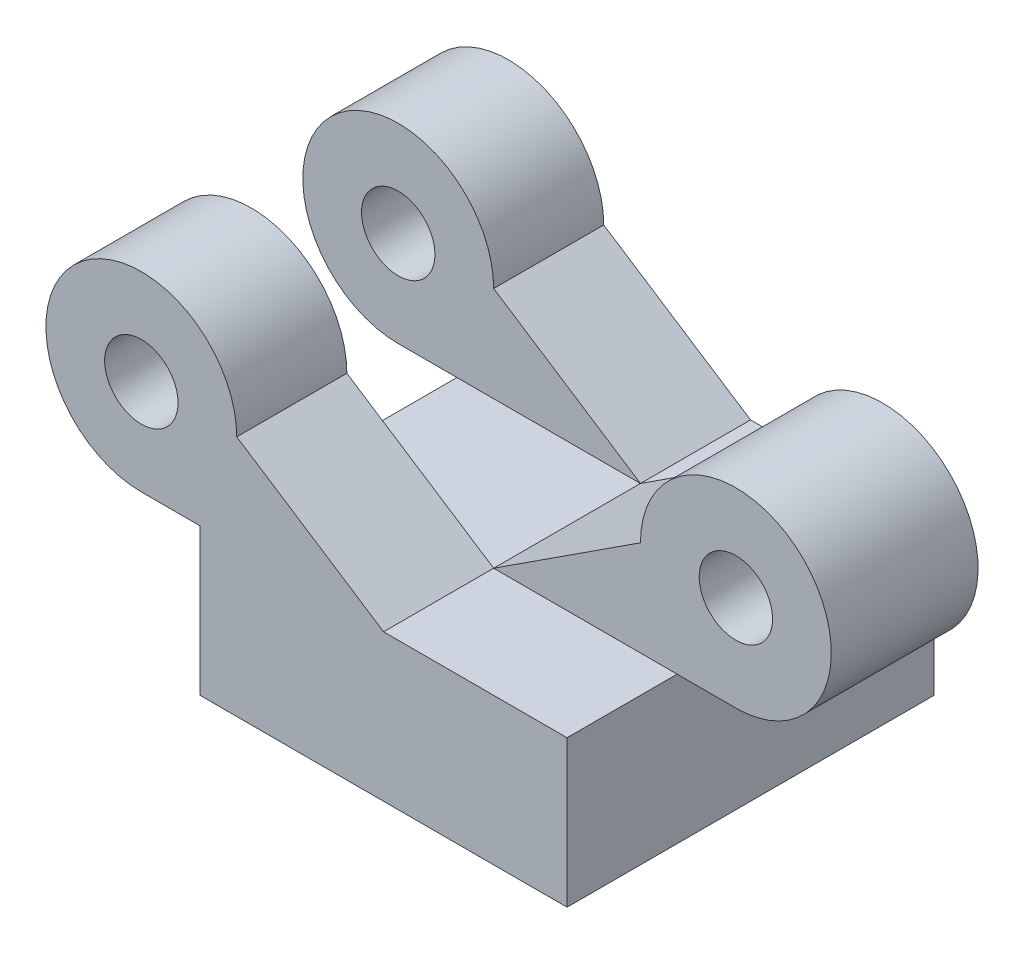
ISO-10303-21;
HEADER;
FILE_DESCRIPTION(('STEP AP214'),'2;1');
FILE_NAME('part.step','',(''),(''),'','','');
FILE_SCHEMA(('AUTOMOTIVE_DESIGN { 1 0 10303 214 1 1 1 1 }'));
ENDSEC;
DATA;
#1=APPLICATION_CONTEXT('core data for automotive mechanical design processes');
#2=APPLICATION_PROTOCOL_DEFINITION('international standard','automotive_design',2000,#1);
#3=PRODUCT_CONTEXT('',#1,'mechanical');
#4=PRODUCT('Part','Part','',(#3));
#5=PRODUCT_RELATED_PRODUCT_CATEGORY('part','',(#4));
#6=PRODUCT_DEFINITION_FORMATION('','',#4);
#7=PRODUCT_DEFINITION_CONTEXT('part definition',#1,'design');
#8=PRODUCT_DEFINITION('design','',#6,#7);
#9=PRODUCT_DEFINITION_SHAPE('','',#8);
#10=(LENGTH_UNIT() NAMED_UNIT(*) SI_UNIT(.MILLI.,.METRE.));
#11=(NAMED_UNIT(*) PLANE_ANGLE_UNIT() SI_UNIT($,.RADIAN.));
#12=(NAMED_UNIT(*) SI_UNIT($,.STERADIAN.) SOLID_ANGLE_UNIT());
#13=UNCERTAINTY_MEASURE_WITH_UNIT(LENGTH_MEASURE(1.E-05),#10,'distance_accuracy_value','');
#14=(GEOMETRIC_REPRESENTATION_CONTEXT(3) GLOBAL_UNCERTAINTY_ASSIGNED_CONTEXT((#13)) GLOBAL_UNIT_ASSIGNED_CONTEXT((#10,
#11,#12)) REPRESENTATION_CONTEXT('',''));
#15=CARTESIAN_POINT('',(0.,0.,0.));
#16=DIRECTION('',(0.,0.,1.));
#17=DIRECTION('',(1.,0.,0.));
#18=AXIS2_PLACEMENT_3D('',#15,#16,#17);
#19=CARTESIAN_POINT('',(-12.5,-10.,12.5));
#20=DIRECTION('',(0.,0.,1.));
#21=DIRECTION('',(1.,0.,0.));
#22=AXIS2_PLACEMENT_3D('',#19,#20,#21);
#23=PLANE('',#22);
#24=CARTESIAN_POINT('',(-16.5,6.5,12.5));
#25=DIRECTION('',(0.,0.,1.));
#26=DIRECTION('',(1.,0.,0.));
#27=AXIS2_PLACEMENT_3D('',#24,#25,#26);
#28=CIRCLE('',#27,2.5);
#29=CARTESIAN_POINT('',(-14.,6.5,12.5));
#30=VERTEX_POINT('',#29);
#31=EDGE_CURVE('E241',#30,#30,#28,.T.);
#32=ORIENTED_EDGE('',*,*,#31,.F.);
#33=EDGE_LOOP('',(#32));
#34=FACE_BOUND('',#33,.T.);
#35=DIRECTION('',(0.,1.,0.));
#36=VECTOR('',#35,1.);
#37=CARTESIAN_POINT('',(12.5,-10.,12.5));
#38=LINE('',#37,#36);
#39=CARTESIAN_POINT('',(12.5,-10.,12.5));
#40=VERTEX_POINT('',#39);
#41=CARTESIAN_POINT('',(12.5,0.,12.5));
#42=VERTEX_POINT('',#41);
#43=EDGE_CURVE('E12',#40,#42,#38,.T.);
#44=ORIENTED_EDGE('',*,*,#43,.T.);
#45=DIRECTION('',(-1.,0.,0.));
#46=VECTOR('',#45,1.);
#47=CARTESIAN_POINT('',(-12.5,0.,12.5));
#48=LINE('',#47,#46);
#49=CARTESIAN_POINT('',(0.,0.,12.5));
#50=VERTEX_POINT('',#49);
#51=EDGE_CURVE('E307',#42,#50,#48,.T.);
#52=ORIENTED_EDGE('',*,*,#51,.T.);
#53=DIRECTION('',(0.838443616300637,-0.544988350595414,0.));
#54=VECTOR('',#53,1.);
#55=CARTESIAN_POINT('',(0.,0.,12.5));
#56=LINE('',#55,#54);
#57=CARTESIAN_POINT('',(-10.,6.5,12.5));
#58=VERTEX_POINT('',#57);
#59=EDGE_CURVE('E252',#58,#50,#56,.T.);
#60=ORIENTED_EDGE('',*,*,#59,.F.);
#61=CARTESIAN_POINT('',(-16.5,6.5,12.5));
#62=DIRECTION('',(0.,0.,1.));
#63=DIRECTION('',(1.,0.,0.));
#64=AXIS2_PLACEMENT_3D('',#61,#62,#63);
#65=CIRCLE('',#64,6.5);
#66=CARTESIAN_POINT('',(-16.5,0.,12.5));
#67=VERTEX_POINT('',#66);
#68=EDGE_CURVE('E246',#58,#67,#65,.T.);
#69=ORIENTED_EDGE('',*,*,#68,.T.);
#70=DIRECTION('',(1.,0.,0.));
#71=VECTOR('',#70,1.);
#72=CARTESIAN_POINT('',(0.,0.,12.5));
#73=LINE('',#72,#71);
#74=CARTESIAN_POINT('',(-12.5,0.,12.5));
#75=VERTEX_POINT('',#74);
#76=EDGE_CURVE('E249',#67,#75,#73,.T.);
#77=ORIENTED_EDGE('',*,*,#76,.T.);
#78=DIRECTION('',(0.,1.,0.));
#79=VECTOR('',#78,1.);
#80=CARTESIAN_POINT('',(-12.5,-10.,12.5));
#81=LINE('',#80,#79);
#82=CARTESIAN_POINT('',(-12.5,-10.,12.5));
#83=VERTEX_POINT('',#82);
#84=EDGE_CURVE('E80',#83,#75,#81,.T.);
#85=ORIENTED_EDGE('',*,*,#84,.F.);
#86=DIRECTION('',(1.,0.,0.));
#87=VECTOR('',#86,1.);
#88=CARTESIAN_POINT('',(-12.5,-10.,12.5));
#89=LINE('',#88,#87);
#90=EDGE_CURVE('E283',#83,#40,#89,.T.);
#91=ORIENTED_EDGE('',*,*,#90,.T.);
#92=EDGE_LOOP('',(#44,#52,#60,#69,#77,#85,#91));
#93=FACE_BOUND('',#92,.T.);
#94=ADVANCED_FACE('F71',(#34,#93),#23,.T.);
#95=CARTESIAN_POINT('',(-12.5,-10.,-12.5));
#96=DIRECTION('',(0.,0.,-1.));
#97=DIRECTION('',(-1.,0.,0.));
#98=AXIS2_PLACEMENT_3D('',#95,#96,#97);
#99=PLANE('',#98);
#100=CARTESIAN_POINT('',(-16.5,6.5,-12.5));
#101=DIRECTION('',(0.,0.,1.));
#102=DIRECTION('',(1.,0.,0.));
#103=AXIS2_PLACEMENT_3D('',#100,#101,#102);
#104=CIRCLE('',#103,2.5);
#105=CARTESIAN_POINT('',(-14.,6.5,-12.5));
#106=VERTEX_POINT('',#105);
#107=EDGE_CURVE('E255',#106,#106,#104,.T.);
#108=ORIENTED_EDGE('',*,*,#107,.T.);
#109=EDGE_LOOP('',(#108));
#110=FACE_BOUND('',#109,.T.);
#111=DIRECTION('',(0.838443616300637,-0.544988350595414,0.));
#112=VECTOR('',#111,1.);
#113=CARTESIAN_POINT('',(0.,0.,-12.5));
#114=LINE('',#113,#112);
#115=CARTESIAN_POINT('',(-10.,6.5,-12.5));
#116=VERTEX_POINT('',#115);
#117=CARTESIAN_POINT('',(0.,0.,-12.5));
#118=VERTEX_POINT('',#117);
#119=EDGE_CURVE('E264',#116,#118,#114,.T.);
#120=ORIENTED_EDGE('',*,*,#119,.T.);
#121=DIRECTION('',(1.,0.,0.));
#122=VECTOR('',#121,1.);
#123=CARTESIAN_POINT('',(-12.5,0.,-12.5));
#124=LINE('',#123,#122);
#125=CARTESIAN_POINT('',(12.5,0.,-12.5));
#126=VERTEX_POINT('',#125);
#127=EDGE_CURVE('E96',#118,#126,#124,.T.);
#128=ORIENTED_EDGE('',*,*,#127,.T.);
#129=DIRECTION('',(0.,1.,0.));
#130=VECTOR('',#129,1.);
#131=CARTESIAN_POINT('',(12.5,-10.,-12.5));
#132=LINE('',#131,#130);
#133=CARTESIAN_POINT('',(12.5,-10.,-12.5));
#134=VERTEX_POINT('',#133);
#135=EDGE_CURVE('E286',#134,#126,#132,.T.);
#136=ORIENTED_EDGE('',*,*,#135,.F.);
#137=DIRECTION('',(-1.,0.,0.));
#138=VECTOR('',#137,1.);
#139=CARTESIAN_POINT('',(-12.5,-10.,-12.5));
#140=LINE('',#139,#138);
#141=CARTESIAN_POINT('',(-12.5,-10.,-12.5));
#142=VERTEX_POINT('',#141);
#143=EDGE_CURVE('E276',#134,#142,#140,.T.);
#144=ORIENTED_EDGE('',*,*,#143,.T.);
#145=DIRECTION('',(0.,1.,0.));
#146=VECTOR('',#145,1.);
#147=CARTESIAN_POINT('',(-12.5,-10.,-12.5));
#148=LINE('',#147,#146);
#149=CARTESIAN_POINT('',(-12.5,0.,-12.5));
#150=VERTEX_POINT('',#149);
#151=EDGE_CURVE('E294',#142,#150,#148,.T.);
#152=ORIENTED_EDGE('',*,*,#151,.T.);
#153=DIRECTION('',(1.,0.,0.));
#154=VECTOR('',#153,1.);
#155=CARTESIAN_POINT('',(0.,0.,-12.5));
#156=LINE('',#155,#154);
#157=CARTESIAN_POINT('',(-16.5,0.,-12.5));
#158=VERTEX_POINT('',#157);
#159=EDGE_CURVE('E261',#158,#150,#156,.T.);
#160=ORIENTED_EDGE('',*,*,#159,.F.);
#161=CARTESIAN_POINT('',(-16.5,6.5,-12.5));
#162=DIRECTION('',(0.,0.,1.));
#163=DIRECTION('',(1.,0.,0.));
#164=AXIS2_PLACEMENT_3D('',#161,#162,#163);
#165=CIRCLE('',#164,6.5);
#166=EDGE_CURVE('E258',#116,#158,#165,.T.);
#167=ORIENTED_EDGE('',*,*,#166,.F.);
#168=EDGE_LOOP('',(#120,#128,#136,#144,#152,#160,#167));
#169=FACE_BOUND('',#168,.T.);
#170=ADVANCED_FACE('F350',(#110,#169),#99,.T.);
#171=CARTESIAN_POINT('',(0.,0.,12.5));
#172=DIRECTION('',(0.,-1.,0.));
#173=DIRECTION('',(1.,0.,0.));
#174=AXIS2_PLACEMENT_3D('',#171,#172,#173);
#175=PLANE('',#174);
#176=DIRECTION('',(0.,0.,-1.));
#177=VECTOR('',#176,1.);
#178=CARTESIAN_POINT('',(12.5,0.,-12.5));
#179=LINE('',#178,#177);
#180=CARTESIAN_POINT('',(12.5,0.,5.));
#181=VERTEX_POINT('',#180);
#182=CARTESIAN_POINT('',(12.5,0.,-5.));
#183=VERTEX_POINT('',#182);
#184=EDGE_CURVE('E268',#181,#183,#179,.T.);
#185=ORIENTED_EDGE('',*,*,#184,.T.);
#186=DIRECTION('',(1.,0.,0.));
#187=VECTOR('',#186,1.);
#188=CARTESIAN_POINT('',(0.,0.,-5.));
#189=LINE('',#188,#187);
#190=CARTESIAN_POINT('',(16.5,0.,-5.));
#191=VERTEX_POINT('',#190);
#192=EDGE_CURVE('E181',#183,#191,#189,.T.);
#193=ORIENTED_EDGE('',*,*,#192,.T.);
#194=DIRECTION('',(0.,0.,-1.));
#195=VECTOR('',#194,1.);
#196=CARTESIAN_POINT('',(16.5,0.,12.5));
#197=LINE('',#196,#195);
#198=CARTESIAN_POINT('',(16.5,0.,5.));
#199=VERTEX_POINT('',#198);
#200=EDGE_CURVE('E239',#199,#191,#197,.T.);
#201=ORIENTED_EDGE('',*,*,#200,.F.);
#202=DIRECTION('',(1.,0.,0.));
#203=VECTOR('',#202,1.);
#204=CARTESIAN_POINT('',(0.,0.,5.));
#205=LINE('',#204,#203);
#206=EDGE_CURVE('E343',#181,#199,#205,.T.);
#207=ORIENTED_EDGE('',*,*,#206,.F.);
#208=EDGE_LOOP('',(#185,#193,#201,#207));
#209=FACE_BOUND('',#208,.T.);
#210=ADVANCED_FACE('F348',(#209),#175,.T.);
#211=CARTESIAN_POINT('',(16.5,6.50000000000001,12.5));
#212=DIRECTION('',(0.,0.,-1.));
#213=DIRECTION('',(-1.,0.,0.));
#214=AXIS2_PLACEMENT_3D('',#211,#212,#213);
#215=CYLINDRICAL_SURFACE('',#214,6.5);
#216=ORIENTED_EDGE('',*,*,#200,.T.);
#217=CARTESIAN_POINT('',(16.5,6.50000000000001,-5.));
#218=DIRECTION('',(0.,0.,-1.));
#219=DIRECTION('',(-1.,0.,0.));
#220=AXIS2_PLACEMENT_3D('',#217,#218,#219);
#221=CIRCLE('',#220,6.5);
#222=CARTESIAN_POINT('',(10.,6.50000000000001,-5.));
#223=VERTEX_POINT('',#222);
#224=EDGE_CURVE('E203',#191,#223,#221,.F.);
#225=ORIENTED_EDGE('',*,*,#224,.T.);
#226=DIRECTION('',(0.,0.,-1.));
#227=VECTOR('',#226,1.);
#228=CARTESIAN_POINT('',(10.,6.50000000000001,12.5));
#229=LINE('',#228,#227);
#230=CARTESIAN_POINT('',(10.,6.50000000000001,5.));
#231=VERTEX_POINT('',#230);
#232=EDGE_CURVE('E202',#231,#223,#229,.T.);
#233=ORIENTED_EDGE('',*,*,#232,.F.);
#234=CARTESIAN_POINT('',(16.5,6.50000000000001,5.));
#235=DIRECTION('',(0.,0.,-1.));
#236=DIRECTION('',(-1.,0.,0.));
#237=AXIS2_PLACEMENT_3D('',#234,#235,#236);
#238=CIRCLE('',#237,6.5);
#239=EDGE_CURVE('E301',#199,#231,#238,.F.);
#240=ORIENTED_EDGE('',*,*,#239,.F.);
#241=EDGE_LOOP('',(#216,#225,#233,#240));
#242=FACE_BOUND('',#241,.T.);
#243=ADVANCED_FACE('F419',(#242),#215,.T.);
#244=CARTESIAN_POINT('',(0.,0.,12.5));
#245=DIRECTION('',(0.544988350595415,-0.838443616300637,0.));
#246=DIRECTION('',(0.838443616300637,0.544988350595415,0.));
#247=AXIS2_PLACEMENT_3D('',#244,#245,#246);
#248=PLANE('',#247);
#249=DIRECTION('',(0.838443616300637,0.544988350595415,0.));
#250=VECTOR('',#249,1.);
#251=CARTESIAN_POINT('',(0.,0.,-5.));
#252=LINE('',#251,#250);
#253=CARTESIAN_POINT('',(0.,0.,-5.));
#254=VERTEX_POINT('',#253);
#255=EDGE_CURVE('E178',#254,#223,#252,.T.);
#256=ORIENTED_EDGE('',*,*,#255,.F.);
#257=DIRECTION('',(0.,0.,1.));
#258=VECTOR('',#257,1.);
#259=CARTESIAN_POINT('',(0.,0.,0.));
#260=LINE('',#259,#258);
#261=CARTESIAN_POINT('',(0.,0.,5.));
#262=VERTEX_POINT('',#261);
#263=EDGE_CURVE('E199',#254,#262,#260,.T.);
#264=ORIENTED_EDGE('',*,*,#263,.T.);
#265=DIRECTION('',(0.838443616300637,0.544988350595415,0.));
#266=VECTOR('',#265,1.);
#267=CARTESIAN_POINT('',(0.,0.,5.));
#268=LINE('',#267,#266);
#269=EDGE_CURVE('E298',#262,#231,#268,.T.);
#270=ORIENTED_EDGE('',*,*,#269,.T.);
#271=ORIENTED_EDGE('',*,*,#232,.T.);
#272=EDGE_LOOP('',(#256,#264,#270,#271));
#273=FACE_BOUND('',#272,.T.);
#274=ADVANCED_FACE('F196',(#273),#248,.F.);
#275=CARTESIAN_POINT('',(-16.5,6.5,-12.5));
#276=DIRECTION('',(0.,0.,1.));
#277=DIRECTION('',(1.,0.,0.));
#278=AXIS2_PLACEMENT_3D('',#275,#276,#277);
#279=CYLINDRICAL_SURFACE('',#278,6.5);
#280=DIRECTION('',(0.,0.,1.));
#281=VECTOR('',#280,1.);
#282=CARTESIAN_POINT('',(-16.5,0.,-12.5));
#283=LINE('',#282,#281);
#284=CARTESIAN_POINT('',(-16.5,0.,-5.));
#285=VERTEX_POINT('',#284);
#286=EDGE_CURVE('E270',#158,#285,#283,.T.);
#287=ORIENTED_EDGE('',*,*,#286,.T.);
#288=CARTESIAN_POINT('',(-16.5,6.5,-5.));
#289=DIRECTION('',(0.,0.,1.));
#290=DIRECTION('',(1.,0.,0.));
#291=AXIS2_PLACEMENT_3D('',#288,#289,#290);
#292=CIRCLE('',#291,6.5);
#293=CARTESIAN_POINT('',(-10.,6.5,-5.));
#294=VERTEX_POINT('',#293);
#295=EDGE_CURVE('E228',#285,#294,#292,.F.);
#296=ORIENTED_EDGE('',*,*,#295,.T.);
#297=DIRECTION('',(0.,0.,1.));
#298=VECTOR('',#297,1.);
#299=CARTESIAN_POINT('',(-10.,6.5,-12.5));
#300=LINE('',#299,#298);
#301=EDGE_CURVE('E227',#116,#294,#300,.T.);
#302=ORIENTED_EDGE('',*,*,#301,.F.);
#303=ORIENTED_EDGE('',*,*,#166,.T.);
#304=EDGE_LOOP('',(#287,#296,#302,#303));
#305=FACE_BOUND('',#304,.T.);
#306=ADVANCED_FACE('F355',(#305),#279,.T.);
#307=CARTESIAN_POINT('',(0.,0.,-12.5));
#308=DIRECTION('',(-0.544988350595414,-0.838443616300637,0.));
#309=DIRECTION('',(0.838443616300637,-0.544988350595414,0.));
#310=AXIS2_PLACEMENT_3D('',#307,#308,#309);
#311=PLANE('',#310);
#312=DIRECTION('',(-0.838443616300637,0.544988350595414,0.));
#313=VECTOR('',#312,1.);
#314=CARTESIAN_POINT('',(0.,0.,-5.));
#315=LINE('',#314,#313);
#316=EDGE_CURVE('E210',#254,#294,#315,.T.);
#317=ORIENTED_EDGE('',*,*,#316,.F.);
#318=DIRECTION('',(0.,0.,-1.));
#319=VECTOR('',#318,1.);
#320=CARTESIAN_POINT('',(0.,0.,0.));
#321=LINE('',#320,#319);
#322=EDGE_CURVE('E183',#254,#118,#321,.T.);
#323=ORIENTED_EDGE('',*,*,#322,.T.);
#324=ORIENTED_EDGE('',*,*,#119,.F.);
#325=ORIENTED_EDGE('',*,*,#301,.T.);
#326=EDGE_LOOP('',(#317,#323,#324,#325));
#327=FACE_BOUND('',#326,.T.);
#328=ADVANCED_FACE('F226',(#327),#311,.F.);
#329=CARTESIAN_POINT('',(-16.5,6.5,-12.5));
#330=DIRECTION('',(0.,0.,1.));
#331=DIRECTION('',(1.,0.,0.));
#332=AXIS2_PLACEMENT_3D('',#329,#330,#331);
#333=CYLINDRICAL_SURFACE('',#332,2.5);
#334=ORIENTED_EDGE('',*,*,#107,.F.);
#335=EDGE_LOOP('',(#334));
#336=FACE_BOUND('',#335,.T.);
#337=CARTESIAN_POINT('',(-16.5,6.5,-5.));
#338=DIRECTION('',(0.,0.,1.));
#339=DIRECTION('',(1.,0.,0.));
#340=AXIS2_PLACEMENT_3D('',#337,#338,#339);
#341=CIRCLE('',#340,2.5);
#342=CARTESIAN_POINT('',(-14.,6.5,-5.));
#343=VERTEX_POINT('',#342);
#344=EDGE_CURVE('E229',#343,#343,#341,.F.);
#345=ORIENTED_EDGE('',*,*,#344,.F.);
#346=EDGE_LOOP('',(#345));
#347=FACE_BOUND('',#346,.T.);
#348=ADVANCED_FACE('F390',(#336,#347),#333,.F.);
#349=CARTESIAN_POINT('',(0.,0.,-12.5));
#350=DIRECTION('',(0.,-1.,0.));
#351=DIRECTION('',(0.,0.,-1.));
#352=AXIS2_PLACEMENT_3D('',#349,#350,#351);
#353=PLANE('',#352);
#354=DIRECTION('',(0.,0.,1.));
#355=VECTOR('',#354,1.);
#356=CARTESIAN_POINT('',(-12.5,0.,-12.5));
#357=LINE('',#356,#355);
#358=CARTESIAN_POINT('',(-12.5,0.,-5.));
#359=VERTEX_POINT('',#358);
#360=EDGE_CURVE('E277',#150,#359,#357,.T.);
#361=ORIENTED_EDGE('',*,*,#360,.T.);
#362=DIRECTION('',(-1.,0.,0.));
#363=VECTOR('',#362,1.);
#364=CARTESIAN_POINT('',(0.,0.,-5.));
#365=LINE('',#364,#363);
#366=EDGE_CURVE('E213',#359,#285,#365,.T.);
#367=ORIENTED_EDGE('',*,*,#366,.T.);
#368=ORIENTED_EDGE('',*,*,#286,.F.);
#369=ORIENTED_EDGE('',*,*,#159,.T.);
#370=EDGE_LOOP('',(#361,#367,#368,#369));
#371=FACE_BOUND('',#370,.T.);
#372=ADVANCED_FACE('F357',(#371),#353,.T.);
#373=CARTESIAN_POINT('',(12.5,-10.,-12.5));
#374=DIRECTION('',(1.,0.,0.));
#375=DIRECTION('',(0.,0.,-1.));
#376=AXIS2_PLACEMENT_3D('',#373,#374,#375);
#377=PLANE('',#376);
#378=EDGE_CURVE('E287',#42,#181,#179,.T.);
#379=ORIENTED_EDGE('',*,*,#378,.F.);
#380=ORIENTED_EDGE('',*,*,#43,.F.);
#381=DIRECTION('',(0.,0.,-1.));
#382=VECTOR('',#381,1.);
#383=CARTESIAN_POINT('',(12.5,-10.,-12.5));
#384=LINE('',#383,#382);
#385=EDGE_CURVE('E273',#40,#134,#384,.T.);
#386=ORIENTED_EDGE('',*,*,#385,.T.);
#387=ORIENTED_EDGE('',*,*,#135,.T.);
#388=DIRECTION('',(0.,0.,1.));
#389=VECTOR('',#388,1.);
#390=CARTESIAN_POINT('',(12.5,0.,-12.5));
#391=LINE('',#390,#389);
#392=EDGE_CURVE('E311',#126,#183,#391,.T.);
#393=ORIENTED_EDGE('',*,*,#392,.T.);
#394=ORIENTED_EDGE('',*,*,#184,.F.);
#395=EDGE_LOOP('',(#379,#380,#386,#387,#393,#394));
#396=FACE_BOUND('',#395,.T.);
#397=ADVANCED_FACE('F73',(#396),#377,.T.);
#398=CARTESIAN_POINT('',(-12.5,-10.,-12.5));
#399=DIRECTION('',(-1.,0.,0.));
#400=DIRECTION('',(0.,0.,1.));
#401=AXIS2_PLACEMENT_3D('',#398,#399,#400);
#402=PLANE('',#401);
#403=ORIENTED_EDGE('',*,*,#360,.F.);
#404=ORIENTED_EDGE('',*,*,#151,.F.);
#405=DIRECTION('',(0.,0.,1.));
#406=VECTOR('',#405,1.);
#407=CARTESIAN_POINT('',(-12.5,-10.,-12.5));
#408=LINE('',#407,#406);
#409=EDGE_CURVE('E280',#142,#83,#408,.T.);
#410=ORIENTED_EDGE('',*,*,#409,.T.);
#411=ORIENTED_EDGE('',*,*,#84,.T.);
#412=CARTESIAN_POINT('',(-12.5,0.,5.));
#413=VERTEX_POINT('',#412);
#414=EDGE_CURVE('E289',#413,#75,#357,.T.);
#415=ORIENTED_EDGE('',*,*,#414,.F.);
#416=DIRECTION('',(0.,0.,-1.));
#417=VECTOR('',#416,1.);
#418=CARTESIAN_POINT('',(-12.5,0.,-12.5));
#419=LINE('',#418,#417);
#420=EDGE_CURVE('E223',#413,#359,#419,.T.);
#421=ORIENTED_EDGE('',*,*,#420,.T.);
#422=EDGE_LOOP('',(#403,#404,#410,#411,#415,#421));
#423=FACE_BOUND('',#422,.T.);
#424=ADVANCED_FACE('F360',(#423),#402,.T.);
#425=CARTESIAN_POINT('',(0.,-10.,0.));
#426=DIRECTION('',(0.,1.,0.));
#427=DIRECTION('',(0.,0.,1.));
#428=AXIS2_PLACEMENT_3D('',#425,#426,#427);
#429=PLANE('',#428);
#430=ORIENTED_EDGE('',*,*,#385,.F.);
#431=ORIENTED_EDGE('',*,*,#90,.F.);
#432=ORIENTED_EDGE('',*,*,#409,.F.);
#433=ORIENTED_EDGE('',*,*,#143,.F.);
#434=EDGE_LOOP('',(#430,#431,#432,#433));
#435=FACE_BOUND('',#434,.T.);
#436=ADVANCED_FACE('F368',(#435),#429,.F.);
#437=CARTESIAN_POINT('',(-16.5,6.5,5.));
#438=DIRECTION('',(0.,0.,1.));
#439=DIRECTION('',(1.,0.,0.));
#440=AXIS2_PLACEMENT_3D('',#437,#438,#439);
#441=CIRCLE('',#440,6.5);
#442=CARTESIAN_POINT('',(-16.5,0.,5.));
#443=VERTEX_POINT('',#442);
#444=CARTESIAN_POINT('',(-10.,6.5,5.));
#445=VERTEX_POINT('',#444);
#446=EDGE_CURVE('E234',#443,#445,#441,.F.);
#447=ORIENTED_EDGE('',*,*,#446,.F.);
#448=EDGE_CURVE('E266',#443,#67,#283,.T.);
#449=ORIENTED_EDGE('',*,*,#448,.T.);
#450=ORIENTED_EDGE('',*,*,#68,.F.);
#451=EDGE_CURVE('E269',#445,#58,#300,.T.);
#452=ORIENTED_EDGE('',*,*,#451,.F.);
#453=EDGE_LOOP('',(#447,#449,#450,#452));
#454=FACE_BOUND('',#453,.T.);
#455=ADVANCED_FACE('F331',(#454),#279,.T.);
#456=DIRECTION('',(0.,0.,-1.));
#457=VECTOR('',#456,1.);
#458=CARTESIAN_POINT('',(0.,0.,12.5));
#459=LINE('',#458,#457);
#460=EDGE_CURVE('E231',#50,#262,#459,.T.);
#461=ORIENTED_EDGE('',*,*,#460,.T.);
#462=DIRECTION('',(-0.838443616300637,0.544988350595414,0.));
#463=VECTOR('',#462,1.);
#464=CARTESIAN_POINT('',(0.,0.,5.));
#465=LINE('',#464,#463);
#466=EDGE_CURVE('E318',#262,#445,#465,.T.);
#467=ORIENTED_EDGE('',*,*,#466,.T.);
#468=ORIENTED_EDGE('',*,*,#451,.T.);
#469=ORIENTED_EDGE('',*,*,#59,.T.);
#470=EDGE_LOOP('',(#461,#467,#468,#469));
#471=FACE_BOUND('',#470,.T.);
#472=ADVANCED_FACE('F329',(#471),#311,.F.);
#473=CARTESIAN_POINT('',(-16.5,6.5,5.));
#474=DIRECTION('',(0.,0.,1.));
#475=DIRECTION('',(1.,0.,0.));
#476=AXIS2_PLACEMENT_3D('',#473,#474,#475);
#477=CIRCLE('',#476,2.5);
#478=CARTESIAN_POINT('',(-14.,6.5,5.));
#479=VERTEX_POINT('',#478);
#480=EDGE_CURVE('E315',#479,#479,#477,.F.);
#481=ORIENTED_EDGE('',*,*,#480,.T.);
#482=EDGE_LOOP('',(#481));
#483=FACE_BOUND('',#482,.T.);
#484=ORIENTED_EDGE('',*,*,#31,.T.);
#485=EDGE_LOOP('',(#484));
#486=FACE_BOUND('',#485,.T.);
#487=ADVANCED_FACE('F387',(#483,#486),#333,.F.);
#488=DIRECTION('',(-1.,0.,0.));
#489=VECTOR('',#488,1.);
#490=CARTESIAN_POINT('',(0.,0.,5.));
#491=LINE('',#490,#489);
#492=EDGE_CURVE('E216',#413,#443,#491,.T.);
#493=ORIENTED_EDGE('',*,*,#492,.F.);
#494=ORIENTED_EDGE('',*,*,#414,.T.);
#495=ORIENTED_EDGE('',*,*,#76,.F.);
#496=ORIENTED_EDGE('',*,*,#448,.F.);
#497=EDGE_LOOP('',(#493,#494,#495,#496));
#498=FACE_BOUND('',#497,.T.);
#499=ADVANCED_FACE('F364',(#498),#353,.T.);
#500=CARTESIAN_POINT('',(0.,22.5,-5.));
#501=DIRECTION('',(0.,0.,1.));
#502=DIRECTION('',(1.,0.,0.));
#503=AXIS2_PLACEMENT_3D('',#500,#501,#502);
#504=PLANE('',#503);
#505=ORIENTED_EDGE('',*,*,#366,.F.);
#506=EDGE_CURVE('E207',#254,#359,#365,.T.);
#507=ORIENTED_EDGE('',*,*,#506,.F.);
#508=ORIENTED_EDGE('',*,*,#316,.T.);
#509=ORIENTED_EDGE('',*,*,#295,.F.);
#510=EDGE_LOOP('',(#505,#507,#508,#509));
#511=FACE_BOUND('',#510,.T.);
#512=ORIENTED_EDGE('',*,*,#344,.T.);
#513=EDGE_LOOP('',(#512));
#514=FACE_BOUND('',#513,.T.);
#515=ADVANCED_FACE('F208',(#511,#514),#504,.T.);
#516=CARTESIAN_POINT('',(0.,22.5,5.));
#517=DIRECTION('',(0.,0.,1.));
#518=DIRECTION('',(1.,0.,0.));
#519=AXIS2_PLACEMENT_3D('',#516,#517,#518);
#520=PLANE('',#519);
#521=ORIENTED_EDGE('',*,*,#446,.T.);
#522=ORIENTED_EDGE('',*,*,#466,.F.);
#523=EDGE_CURVE('E221',#262,#413,#491,.T.);
#524=ORIENTED_EDGE('',*,*,#523,.T.);
#525=ORIENTED_EDGE('',*,*,#492,.T.);
#526=EDGE_LOOP('',(#521,#522,#524,#525));
#527=FACE_BOUND('',#526,.T.);
#528=ORIENTED_EDGE('',*,*,#480,.F.);
#529=EDGE_LOOP('',(#528));
#530=FACE_BOUND('',#529,.T.);
#531=ADVANCED_FACE('F322',(#527,#530),#520,.F.);
#532=CARTESIAN_POINT('',(0.,0.,0.));
#533=DIRECTION('',(0.,1.,0.));
#534=DIRECTION('',(0.,0.,1.));
#535=AXIS2_PLACEMENT_3D('',#532,#533,#534);
#536=PLANE('',#535);
#537=ORIENTED_EDGE('',*,*,#523,.F.);
#538=ORIENTED_EDGE('',*,*,#263,.F.);
#539=ORIENTED_EDGE('',*,*,#506,.T.);
#540=ORIENTED_EDGE('',*,*,#420,.F.);
#541=EDGE_LOOP('',(#537,#538,#539,#540));
#542=FACE_BOUND('',#541,.T.);
#543=ADVANCED_FACE('F219',(#542),#536,.T.);
#544=CARTESIAN_POINT('',(0.,22.5,5.));
#545=DIRECTION('',(0.,0.,-1.));
#546=DIRECTION('',(-1.,0.,0.));
#547=AXIS2_PLACEMENT_3D('',#544,#545,#546);
#548=PLANE('',#547);
#549=ORIENTED_EDGE('',*,*,#239,.T.);
#550=ORIENTED_EDGE('',*,*,#269,.F.);
#551=EDGE_CURVE('E88',#262,#181,#205,.T.);
#552=ORIENTED_EDGE('',*,*,#551,.T.);
#553=ORIENTED_EDGE('',*,*,#206,.T.);
#554=EDGE_LOOP('',(#549,#550,#552,#553));
#555=FACE_BOUND('',#554,.T.);
#556=CARTESIAN_POINT('',(16.5,6.50000000000001,5.));
#557=DIRECTION('',(0.,0.,-1.));
#558=DIRECTION('',(-1.,0.,0.));
#559=AXIS2_PLACEMENT_3D('',#556,#557,#558);
#560=CIRCLE('',#559,2.5);
#561=CARTESIAN_POINT('',(14.,6.50000000000001,5.));
#562=VERTEX_POINT('',#561);
#563=EDGE_CURVE('E190',#562,#562,#560,.F.);
#564=ORIENTED_EDGE('',*,*,#563,.F.);
#565=EDGE_LOOP('',(#564));
#566=FACE_BOUND('',#565,.T.);
#567=ADVANCED_FACE('F341',(#555,#566),#548,.F.);
#568=CARTESIAN_POINT('',(0.,0.,0.));
#569=DIRECTION('',(0.,1.,0.));
#570=DIRECTION('',(0.,0.,1.));
#571=AXIS2_PLACEMENT_3D('',#568,#569,#570);
#572=PLANE('',#571);
#573=ORIENTED_EDGE('',*,*,#378,.T.);
#574=ORIENTED_EDGE('',*,*,#551,.F.);
#575=ORIENTED_EDGE('',*,*,#460,.F.);
#576=ORIENTED_EDGE('',*,*,#51,.F.);
#577=EDGE_LOOP('',(#573,#574,#575,#576));
#578=FACE_BOUND('',#577,.T.);
#579=ADVANCED_FACE('F336',(#578),#572,.T.);
#580=CARTESIAN_POINT('',(0.,22.5,-5.));
#581=DIRECTION('',(0.,0.,-1.));
#582=DIRECTION('',(-1.,0.,0.));
#583=AXIS2_PLACEMENT_3D('',#580,#581,#582);
#584=PLANE('',#583);
#585=ORIENTED_EDGE('',*,*,#192,.F.);
#586=EDGE_CURVE('E174',#254,#183,#189,.T.);
#587=ORIENTED_EDGE('',*,*,#586,.F.);
#588=ORIENTED_EDGE('',*,*,#255,.T.);
#589=ORIENTED_EDGE('',*,*,#224,.F.);
#590=EDGE_LOOP('',(#585,#587,#588,#589));
#591=FACE_BOUND('',#590,.T.);
#592=CARTESIAN_POINT('',(16.5,6.50000000000001,-5.));
#593=DIRECTION('',(0.,0.,-1.));
#594=DIRECTION('',(-1.,0.,0.));
#595=AXIS2_PLACEMENT_3D('',#592,#593,#594);
#596=CIRCLE('',#595,2.5);
#597=CARTESIAN_POINT('',(14.,6.50000000000001,-5.));
#598=VERTEX_POINT('',#597);
#599=EDGE_CURVE('E75',#598,#598,#596,.F.);
#600=ORIENTED_EDGE('',*,*,#599,.T.);
#601=EDGE_LOOP('',(#600));
#602=FACE_BOUND('',#601,.T.);
#603=ADVANCED_FACE('F175',(#591,#602),#584,.T.);
#604=CARTESIAN_POINT('',(0.,0.,0.));
#605=DIRECTION('',(0.,1.,0.));
#606=DIRECTION('',(0.,0.,1.));
#607=AXIS2_PLACEMENT_3D('',#604,#605,#606);
#608=PLANE('',#607);
#609=ORIENTED_EDGE('',*,*,#127,.F.);
#610=ORIENTED_EDGE('',*,*,#322,.F.);
#611=ORIENTED_EDGE('',*,*,#586,.T.);
#612=ORIENTED_EDGE('',*,*,#392,.F.);
#613=EDGE_LOOP('',(#609,#610,#611,#612));
#614=FACE_BOUND('',#613,.T.);
#615=ADVANCED_FACE('F185',(#614),#608,.T.);
#616=CARTESIAN_POINT('',(16.5,6.50000000000001,12.5));
#617=DIRECTION('',(0.,0.,-1.));
#618=DIRECTION('',(-1.,0.,0.));
#619=AXIS2_PLACEMENT_3D('',#616,#617,#618);
#620=CYLINDRICAL_SURFACE('',#619,2.5);
#621=CARTESIAN_POINT('',(14.,6.50000000000001,5.));
#622=CARTESIAN_POINT('',(14.,6.50000000000001,4.89583333333333));
#623=CARTESIAN_POINT('',(14.,6.50000000000001,4.79166666666666));
#624=CARTESIAN_POINT('',(14.,6.50000000000001,4.58333333333333));
#625=CARTESIAN_POINT('',(14.,6.50000000000001,4.47916666666666));
#626=CARTESIAN_POINT('',(14.,6.50000000000001,4.27083333333333));
#627=CARTESIAN_POINT('',(14.,6.50000000000001,4.16666666666667));
#628=CARTESIAN_POINT('',(14.,6.50000000000001,3.95833333333333));
#629=CARTESIAN_POINT('',(14.,6.50000000000001,3.85416666666667));
#630=CARTESIAN_POINT('',(14.,6.50000000000001,3.64583333333333));
#631=CARTESIAN_POINT('',(14.,6.50000000000001,3.54166666666666));
#632=CARTESIAN_POINT('',(14.,6.50000000000001,3.33333333333333));
#633=CARTESIAN_POINT('',(14.,6.50000000000001,3.22916666666666));
#634=CARTESIAN_POINT('',(14.,6.50000000000001,3.02083333333333));
#635=CARTESIAN_POINT('',(14.,6.50000000000001,2.91666666666666));
#636=CARTESIAN_POINT('',(14.,6.50000000000001,2.70833333333333));
#637=CARTESIAN_POINT('',(14.,6.50000000000001,2.60416666666666));
#638=CARTESIAN_POINT('',(14.,6.50000000000001,2.39583333333333));
#639=CARTESIAN_POINT('',(14.,6.50000000000001,2.29166666666667));
#640=CARTESIAN_POINT('',(14.,6.50000000000001,2.08333333333333));
#641=CARTESIAN_POINT('',(14.,6.50000000000001,1.97916666666667));
#642=CARTESIAN_POINT('',(14.,6.50000000000001,1.77083333333333));
#643=CARTESIAN_POINT('',(14.,6.50000000000001,1.66666666666666));
#644=CARTESIAN_POINT('',(14.,6.50000000000001,1.45833333333333));
#645=CARTESIAN_POINT('',(14.,6.50000000000001,1.35416666666666));
#646=CARTESIAN_POINT('',(14.,6.50000000000001,1.14583333333333));
#647=CARTESIAN_POINT('',(14.,6.50000000000001,1.04166666666666));
#648=CARTESIAN_POINT('',(14.,6.50000000000001,0.833333333333331));
#649=CARTESIAN_POINT('',(14.,6.50000000000001,0.729166666666664));
#650=CARTESIAN_POINT('',(14.,6.50000000000001,0.520833333333331));
#651=CARTESIAN_POINT('',(14.,6.50000000000001,0.416666666666665));
#652=CARTESIAN_POINT('',(14.,6.50000000000001,0.208333333333332));
#653=CARTESIAN_POINT('',(14.,6.50000000000001,0.104166666666665));
#654=CARTESIAN_POINT('',(14.,6.50000000000001,-0.104166666666668));
#655=CARTESIAN_POINT('',(14.,6.50000000000001,-0.208333333333335));
#656=CARTESIAN_POINT('',(14.,6.50000000000001,-0.416666666666668));
#657=CARTESIAN_POINT('',(14.,6.50000000000001,-0.520833333333334));
#658=CARTESIAN_POINT('',(14.,6.50000000000001,-0.729166666666667));
#659=CARTESIAN_POINT('',(14.,6.50000000000001,-0.833333333333334));
#660=CARTESIAN_POINT('',(14.,6.50000000000001,-1.04166666666667));
#661=CARTESIAN_POINT('',(14.,6.50000000000001,-1.14583333333333));
#662=CARTESIAN_POINT('',(14.,6.50000000000001,-1.35416666666667));
#663=CARTESIAN_POINT('',(14.,6.50000000000001,-1.45833333333333));
#664=CARTESIAN_POINT('',(14.,6.50000000000001,-1.66666666666667));
#665=CARTESIAN_POINT('',(14.,6.50000000000001,-1.77083333333334));
#666=CARTESIAN_POINT('',(14.,6.50000000000001,-1.97916666666667));
#667=CARTESIAN_POINT('',(14.,6.50000000000001,-2.08333333333334));
#668=CARTESIAN_POINT('',(14.,6.50000000000001,-2.29166666666667));
#669=CARTESIAN_POINT('',(14.,6.50000000000001,-2.39583333333334));
#670=CARTESIAN_POINT('',(14.,6.50000000000001,-2.60416666666667));
#671=CARTESIAN_POINT('',(14.,6.50000000000001,-2.70833333333334));
#672=CARTESIAN_POINT('',(14.,6.50000000000001,-2.91666666666667));
#673=CARTESIAN_POINT('',(14.,6.50000000000001,-3.02083333333333));
#674=CARTESIAN_POINT('',(14.,6.50000000000001,-3.22916666666667));
#675=CARTESIAN_POINT('',(14.,6.50000000000001,-3.33333333333333));
#676=CARTESIAN_POINT('',(14.,6.50000000000001,-3.54166666666667));
#677=CARTESIAN_POINT('',(14.,6.50000000000001,-3.64583333333333));
#678=CARTESIAN_POINT('',(14.,6.50000000000001,-3.85416666666667));
#679=CARTESIAN_POINT('',(14.,6.50000000000001,-3.95833333333333));
#680=CARTESIAN_POINT('',(14.,6.50000000000001,-4.16666666666667));
#681=CARTESIAN_POINT('',(14.,6.50000000000001,-4.27083333333333));
#682=CARTESIAN_POINT('',(14.,6.50000000000001,-4.47916666666667));
#683=CARTESIAN_POINT('',(14.,6.50000000000001,-4.58333333333333));
#684=CARTESIAN_POINT('',(14.,6.50000000000001,-4.79166666666667));
#685=CARTESIAN_POINT('',(14.,6.50000000000001,-4.89583333333333));
#686=CARTESIAN_POINT('',(14.,6.50000000000001,-5.));
#687=B_SPLINE_CURVE_WITH_KNOTS('',3,(#621,#622,#623,#624,#625,#626,#627,#628,#629,#630,#631,
#632,#633,#634,#635,#636,#637,#638,#639,#640,#641,#642,#643,#644,#645,#646,#647,#648,#649,#650,
#651,#652,#653,#654,#655,#656,#657,#658,#659,#660,#661,#662,#663,#664,#665,#666,#667,#668,#669,
#670,#671,#672,#673,#674,#675,#676,#677,#678,#679,#680,#681,#682,#683,#684,#685,#686),
.UNSPECIFIED.,.F.,.F.,(4,2,2,2,2,2,2,2,2,2,2,2,2,2,2,2,2,2,2,2,2,2,2,2,2,2,2,2,2,2,2,2,4),(0.,
0.3125,0.625000000000001,0.937499999999999,1.25,1.5625,1.875,2.1875,2.5,2.8125,3.125,3.4375,
3.75,4.0625,4.375,4.6875,5.,5.3125,5.625,5.9375,6.25,6.5625,6.875,7.1875,7.5,7.8125,8.125,
8.4375,8.75,9.0625,9.375,9.6875,10.),.UNSPECIFIED.);
#688=EDGE_CURVE('BSEAM414',#562,#598,#687,.T.);
#689=ORIENTED_EDGE('',*,*,#563,.T.);
#690=ORIENTED_EDGE('',*,*,#599,.F.);
#691=ORIENTED_EDGE('',*,*,#688,.T.);
#692=ORIENTED_EDGE('',*,*,#688,.F.);
#693=EDGE_LOOP('',(#689,#691,#690,#692));
#694=FACE_BOUND('',#693,.T.);
#695=ADVANCED_FACE('F414',(#694),#620,.F.);
#696=CLOSED_SHELL('',(#94,#170,#210,#243,#274,#306,#328,#348,#372,#397,#424,#436,#455,#472,#487,
#499,#515,#531,#543,#567,#579,#603,#615,#695));
#697=MANIFOLD_SOLID_BREP('B2',#696);
#698=ADVANCED_BREP_SHAPE_REPRESENTATION('',(#18,#697),#14);
#699=SHAPE_DEFINITION_REPRESENTATION(#9,#698);
ENDSEC;
END-ISO-10303-21;
